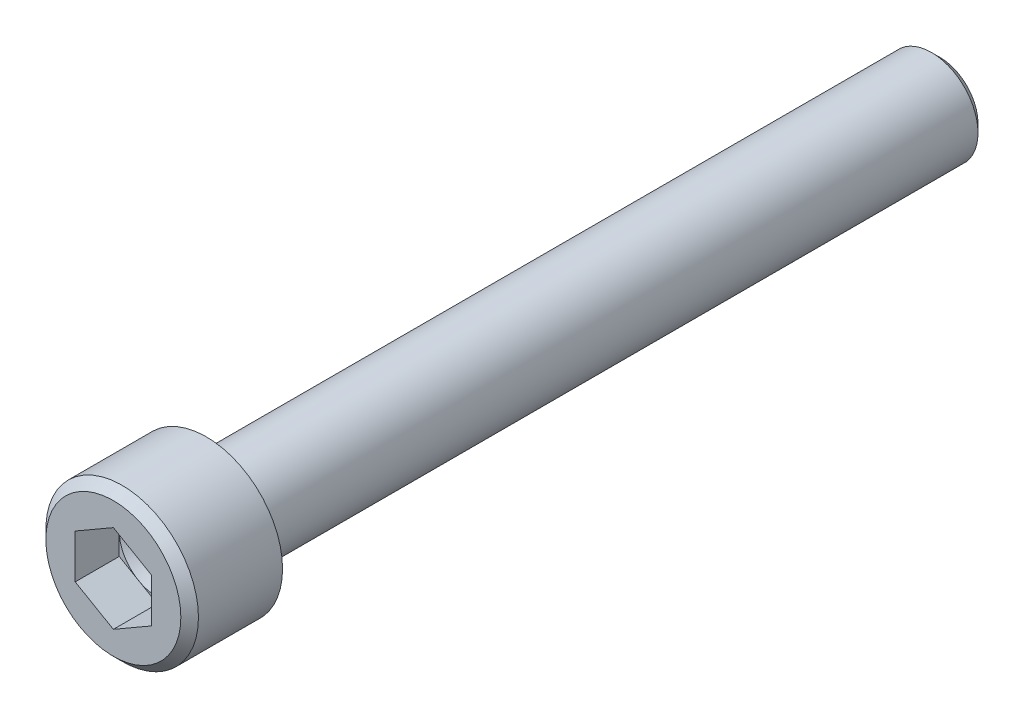
ISO-10303-21;
HEADER;
FILE_DESCRIPTION(('STEP AP214'),'2;1');
FILE_NAME('part.step','',(''),(''),'','','');
FILE_SCHEMA(('AUTOMOTIVE_DESIGN { 1 0 10303 214 1 1 1 1 }'));
ENDSEC;
DATA;
#1=APPLICATION_CONTEXT('core data for automotive mechanical design processes');
#2=APPLICATION_PROTOCOL_DEFINITION('international standard','automotive_design',2000,#1);
#3=PRODUCT_CONTEXT('',#1,'mechanical');
#4=PRODUCT('Part','Part','',(#3));
#5=PRODUCT_RELATED_PRODUCT_CATEGORY('part','',(#4));
#6=PRODUCT_DEFINITION_FORMATION('','',#4);
#7=PRODUCT_DEFINITION_CONTEXT('part definition',#1,'design');
#8=PRODUCT_DEFINITION('design','',#6,#7);
#9=PRODUCT_DEFINITION_SHAPE('','',#8);
#10=(LENGTH_UNIT() NAMED_UNIT(*) SI_UNIT(.MILLI.,.METRE.));
#11=(NAMED_UNIT(*) PLANE_ANGLE_UNIT() SI_UNIT($,.RADIAN.));
#12=(NAMED_UNIT(*) SI_UNIT($,.STERADIAN.) SOLID_ANGLE_UNIT());
#13=UNCERTAINTY_MEASURE_WITH_UNIT(LENGTH_MEASURE(1.E-05),#10,'distance_accuracy_value','');
#14=(GEOMETRIC_REPRESENTATION_CONTEXT(3) GLOBAL_UNCERTAINTY_ASSIGNED_CONTEXT((#13)) GLOBAL_UNIT_ASSIGNED_CONTEXT((#10,
#11,#12)) REPRESENTATION_CONTEXT('',''));
#15=CARTESIAN_POINT('',(0.,0.,0.));
#16=DIRECTION('',(0.,0.,1.));
#17=DIRECTION('',(1.,0.,0.));
#18=AXIS2_PLACEMENT_3D('',#15,#16,#17);
#19=CARTESIAN_POINT('',(0.,0.,2.54));
#20=DIRECTION('',(0.,0.,1.));
#21=DIRECTION('',(1.,0.,0.));
#22=AXIS2_PLACEMENT_3D('',#19,#20,#21);
#23=PLANE('',#22);
#24=DIRECTION('',(0.,1.,0.));
#25=VECTOR('',#24,1.);
#26=CARTESIAN_POINT('',(-1.9812,0.,2.54));
#27=LINE('',#26,#25);
#28=CARTESIAN_POINT('',(-1.9812,0.,2.54));
#29=VERTEX_POINT('',#28);
#30=CARTESIAN_POINT('',(-1.9812,1.14384635331848,2.54));
#31=VERTEX_POINT('',#30);
#32=EDGE_CURVE('E398',#29,#31,#27,.T.);
#33=ORIENTED_EDGE('',*,*,#32,.F.);
#34=CARTESIAN_POINT('',(0.,0.,2.54));
#35=DIRECTION('',(0.,0.,-1.));
#36=DIRECTION('',(-1.,0.,0.));
#37=AXIS2_PLACEMENT_3D('',#34,#35,#36);
#38=CIRCLE('',#37,1.9812);
#39=CARTESIAN_POINT('',(-0.9906,1.71576952997773,2.54));
#40=VERTEX_POINT('',#39);
#41=EDGE_CURVE('E33',#29,#40,#38,.T.);
#42=ORIENTED_EDGE('',*,*,#41,.T.);
#43=DIRECTION('',(0.866025403784439,0.5,0.));
#44=VECTOR('',#43,1.);
#45=CARTESIAN_POINT('',(0.163354175866616,2.38200528404682,2.54));
#46=LINE('',#45,#44);
#47=EDGE_CURVE('E393',#31,#40,#46,.T.);
#48=ORIENTED_EDGE('',*,*,#47,.F.);
#49=EDGE_LOOP('',(#33,#42,#48));
#50=FACE_BOUND('',#49,.T.);
#51=ADVANCED_FACE('F17',(#50),#23,.T.);
#52=CARTESIAN_POINT('',(0.,2.28769270663697,2.54));
#53=VERTEX_POINT('',#52);
#54=EDGE_CURVE('E390',#40,#53,#46,.T.);
#55=ORIENTED_EDGE('',*,*,#54,.F.);
#56=CARTESIAN_POINT('',(0.9906,1.71576952997773,2.54));
#57=VERTEX_POINT('',#56);
#58=EDGE_CURVE('E224',#40,#57,#38,.T.);
#59=ORIENTED_EDGE('',*,*,#58,.T.);
#60=DIRECTION('',(0.866025403784439,-0.5,0.));
#61=VECTOR('',#60,1.);
#62=CARTESIAN_POINT('',(-0.163354175866613,2.38200528404681,2.54));
#63=LINE('',#62,#61);
#64=EDGE_CURVE('E382',#53,#57,#63,.T.);
#65=ORIENTED_EDGE('',*,*,#64,.F.);
#66=EDGE_LOOP('',(#55,#59,#65));
#67=FACE_BOUND('',#66,.T.);
#68=ADVANCED_FACE('F105',(#67),#23,.T.);
#69=CARTESIAN_POINT('',(1.9812,1.14384635331849,2.54));
#70=VERTEX_POINT('',#69);
#71=EDGE_CURVE('E189',#57,#70,#63,.T.);
#72=ORIENTED_EDGE('',*,*,#71,.F.);
#73=CARTESIAN_POINT('',(1.9812,0.,2.54));
#74=VERTEX_POINT('',#73);
#75=EDGE_CURVE('E379',#57,#74,#38,.T.);
#76=ORIENTED_EDGE('',*,*,#75,.T.);
#77=DIRECTION('',(0.,-1.,0.));
#78=VECTOR('',#77,1.);
#79=CARTESIAN_POINT('',(1.9812,0.,2.54));
#80=LINE('',#79,#78);
#81=EDGE_CURVE('E160',#70,#74,#80,.T.);
#82=ORIENTED_EDGE('',*,*,#81,.F.);
#83=EDGE_LOOP('',(#72,#76,#82));
#84=FACE_BOUND('',#83,.T.);
#85=ADVANCED_FACE('F111',(#84),#23,.T.);
#86=CARTESIAN_POINT('',(1.9812,-1.14384635331849,2.54));
#87=VERTEX_POINT('',#86);
#88=EDGE_CURVE('E155',#74,#87,#80,.T.);
#89=ORIENTED_EDGE('',*,*,#88,.F.);
#90=CARTESIAN_POINT('',(0.9906,-1.71576952997773,2.54));
#91=VERTEX_POINT('',#90);
#92=EDGE_CURVE('E417',#74,#91,#38,.T.);
#93=ORIENTED_EDGE('',*,*,#92,.T.);
#94=DIRECTION('',(-0.866025403784438,-0.5,0.));
#95=VECTOR('',#94,1.);
#96=CARTESIAN_POINT('',(2.14455417586661,-1.04953377590865,2.54));
#97=LINE('',#96,#95);
#98=EDGE_CURVE('E148',#87,#91,#97,.T.);
#99=ORIENTED_EDGE('',*,*,#98,.F.);
#100=EDGE_LOOP('',(#89,#93,#99));
#101=FACE_BOUND('',#100,.T.);
#102=ADVANCED_FACE('F129',(#101),#23,.T.);
#103=CARTESIAN_POINT('',(0.,-2.28769270663697,2.54));
#104=VERTEX_POINT('',#103);
#105=EDGE_CURVE('E141',#91,#104,#97,.T.);
#106=ORIENTED_EDGE('',*,*,#105,.F.);
#107=CARTESIAN_POINT('',(-0.9906,-1.71576952997773,2.54));
#108=VERTEX_POINT('',#107);
#109=EDGE_CURVE('E143',#91,#108,#38,.T.);
#110=ORIENTED_EDGE('',*,*,#109,.T.);
#111=DIRECTION('',(-0.866025403784439,0.5,0.));
#112=VECTOR('',#111,1.);
#113=CARTESIAN_POINT('',(-2.14455417586661,-1.04953377590865,2.54));
#114=LINE('',#113,#112);
#115=EDGE_CURVE('E145',#104,#108,#114,.T.);
#116=ORIENTED_EDGE('',*,*,#115,.F.);
#117=EDGE_LOOP('',(#106,#110,#116));
#118=FACE_BOUND('',#117,.T.);
#119=ADVANCED_FACE('F119',(#118),#23,.T.);
#120=CARTESIAN_POINT('',(0.,0.,4.826));
#121=DIRECTION('',(0.,0.,1.));
#122=DIRECTION('',(1.,0.,0.));
#123=AXIS2_PLACEMENT_3D('',#120,#121,#122);
#124=PLANE('',#123);
#125=CARTESIAN_POINT('',(0.,0.,4.826));
#126=DIRECTION('',(0.,0.,1.));
#127=DIRECTION('',(1.,0.,0.));
#128=AXIS2_PLACEMENT_3D('',#125,#126,#127);
#129=CIRCLE('',#128,3.5052);
#130=CARTESIAN_POINT('',(3.5052,0.,4.826));
#131=VERTEX_POINT('',#130);
#132=EDGE_CURVE('E210',#131,#131,#129,.T.);
#133=ORIENTED_EDGE('',*,*,#132,.T.);
#134=EDGE_LOOP('',(#133));
#135=FACE_BOUND('',#134,.T.);
#136=DIRECTION('',(0.866025403784439,0.5,0.));
#137=VECTOR('',#136,1.);
#138=CARTESIAN_POINT('',(0.163354175866616,2.38200528404682,4.826));
#139=LINE('',#138,#137);
#140=CARTESIAN_POINT('',(-1.9812,1.14384635331848,4.826));
#141=VERTEX_POINT('',#140);
#142=CARTESIAN_POINT('',(0.,2.28769270663697,4.826));
#143=VERTEX_POINT('',#142);
#144=EDGE_CURVE('E171',#141,#143,#139,.T.);
#145=ORIENTED_EDGE('',*,*,#144,.T.);
#146=DIRECTION('',(0.866025403784439,-0.5,0.));
#147=VECTOR('',#146,1.);
#148=CARTESIAN_POINT('',(-0.163354175866613,2.38200528404681,4.826));
#149=LINE('',#148,#147);
#150=CARTESIAN_POINT('',(1.9812,1.14384635331849,4.826));
#151=VERTEX_POINT('',#150);
#152=EDGE_CURVE('E168',#143,#151,#149,.T.);
#153=ORIENTED_EDGE('',*,*,#152,.T.);
#154=DIRECTION('',(0.,-1.,0.));
#155=VECTOR('',#154,1.);
#156=CARTESIAN_POINT('',(1.9812,0.,4.826));
#157=LINE('',#156,#155);
#158=CARTESIAN_POINT('',(1.9812,-1.14384635331849,4.826));
#159=VERTEX_POINT('',#158);
#160=EDGE_CURVE('E185',#151,#159,#157,.T.);
#161=ORIENTED_EDGE('',*,*,#160,.T.);
#162=DIRECTION('',(-0.866025403784438,-0.5,0.));
#163=VECTOR('',#162,1.);
#164=CARTESIAN_POINT('',(2.14455417586661,-1.04953377590865,4.826));
#165=LINE('',#164,#163);
#166=CARTESIAN_POINT('',(0.,-2.28769270663697,4.826));
#167=VERTEX_POINT('',#166);
#168=EDGE_CURVE('E41',#159,#167,#165,.T.);
#169=ORIENTED_EDGE('',*,*,#168,.T.);
#170=DIRECTION('',(-0.866025403784439,0.5,0.));
#171=VECTOR('',#170,1.);
#172=CARTESIAN_POINT('',(-2.14455417586661,-1.04953377590865,4.826));
#173=LINE('',#172,#171);
#174=CARTESIAN_POINT('',(-1.9812,-1.14384635331849,4.826));
#175=VERTEX_POINT('',#174);
#176=EDGE_CURVE('E179',#167,#175,#173,.T.);
#177=ORIENTED_EDGE('',*,*,#176,.T.);
#178=DIRECTION('',(0.,1.,0.));
#179=VECTOR('',#178,1.);
#180=CARTESIAN_POINT('',(-1.9812,0.,4.826));
#181=LINE('',#180,#179);
#182=EDGE_CURVE('E175',#175,#141,#181,.T.);
#183=ORIENTED_EDGE('',*,*,#182,.T.);
#184=EDGE_LOOP('',(#145,#153,#161,#169,#177,#183));
#185=FACE_BOUND('',#184,.T.);
#186=ADVANCED_FACE('F128',(#135,#185),#124,.T.);
#187=CARTESIAN_POINT('',(0.,0.,4.826));
#188=DIRECTION('',(0.,0.,-1.));
#189=DIRECTION('',(-1.,0.,0.));
#190=AXIS2_PLACEMENT_3D('',#187,#188,#189);
#191=CYLINDRICAL_SURFACE('',#190,3.9624);
#192=CARTESIAN_POINT('',(0.,0.,4.3688));
#193=DIRECTION('',(0.,0.,1.));
#194=DIRECTION('',(1.,0.,0.));
#195=AXIS2_PLACEMENT_3D('',#192,#193,#194);
#196=CIRCLE('',#195,3.9624);
#197=CARTESIAN_POINT('',(3.9624,0.,4.3688));
#198=VERTEX_POINT('',#197);
#199=EDGE_CURVE('E214',#198,#198,#196,.F.);
#200=ORIENTED_EDGE('',*,*,#199,.T.);
#201=EDGE_LOOP('',(#200));
#202=FACE_BOUND('',#201,.T.);
#203=CARTESIAN_POINT('',(0.,0.,0.));
#204=DIRECTION('',(0.,0.,1.));
#205=DIRECTION('',(1.,0.,0.));
#206=AXIS2_PLACEMENT_3D('',#203,#204,#205);
#207=CIRCLE('',#206,3.9624);
#208=CARTESIAN_POINT('',(3.9624,0.,0.));
#209=VERTEX_POINT('',#208);
#210=EDGE_CURVE('E206',#209,#209,#207,.T.);
#211=ORIENTED_EDGE('',*,*,#210,.T.);
#212=EDGE_LOOP('',(#211));
#213=FACE_BOUND('',#212,.T.);
#214=ADVANCED_FACE('F134',(#202,#213),#191,.T.);
#215=CARTESIAN_POINT('',(0.,0.,0.));
#216=DIRECTION('',(0.,0.,1.));
#217=DIRECTION('',(1.,0.,0.));
#218=AXIS2_PLACEMENT_3D('',#215,#216,#217);
#219=PLANE('',#218);
#220=CARTESIAN_POINT('',(0.,0.,0.));
#221=DIRECTION('',(0.,0.,1.));
#222=DIRECTION('',(1.,0.,0.));
#223=AXIS2_PLACEMENT_3D('',#220,#221,#222);
#224=CIRCLE('',#223,2.5654);
#225=CARTESIAN_POINT('',(2.5654,0.,0.));
#226=VERTEX_POINT('',#225);
#227=EDGE_CURVE('E223',#226,#226,#224,.T.);
#228=ORIENTED_EDGE('',*,*,#227,.T.);
#229=EDGE_LOOP('',(#228));
#230=FACE_BOUND('',#229,.T.);
#231=ORIENTED_EDGE('',*,*,#210,.F.);
#232=EDGE_LOOP('',(#231));
#233=FACE_BOUND('',#232,.T.);
#234=ADVANCED_FACE('F323',(#230,#233),#219,.F.);
#235=CARTESIAN_POINT('',(0.,0.,4.826));
#236=DIRECTION('',(0.,0.,-1.));
#237=DIRECTION('',(-1.,0.,0.));
#238=AXIS2_PLACEMENT_3D('',#235,#236,#237);
#239=CONICAL_SURFACE('',#238,3.5052,0.785398163397449);
#240=ORIENTED_EDGE('',*,*,#199,.F.);
#241=EDGE_LOOP('',(#240));
#242=FACE_BOUND('',#241,.T.);
#243=ORIENTED_EDGE('',*,*,#132,.F.);
#244=EDGE_LOOP('',(#243));
#245=FACE_BOUND('',#244,.T.);
#246=ADVANCED_FACE('F314',(#242,#245),#239,.T.);
#247=CARTESIAN_POINT('',(-0.163354175866613,2.38200528404681,2.54));
#248=DIRECTION('',(-0.5,-0.866025403784439,0.));
#249=DIRECTION('',(0.866025403784439,-0.5,0.));
#250=AXIS2_PLACEMENT_3D('',#247,#248,#249);
#251=PLANE('',#250);
#252=ORIENTED_EDGE('',*,*,#152,.F.);
#253=DIRECTION('',(0.,0.,1.));
#254=VECTOR('',#253,1.);
#255=CARTESIAN_POINT('',(0.,2.28769270663697,2.54));
#256=LINE('',#255,#254);
#257=EDGE_CURVE('E203',#53,#143,#256,.T.);
#258=ORIENTED_EDGE('',*,*,#257,.F.);
#259=ORIENTED_EDGE('',*,*,#64,.T.);
#260=ORIENTED_EDGE('',*,*,#71,.T.);
#261=DIRECTION('',(0.,0.,1.));
#262=VECTOR('',#261,1.);
#263=CARTESIAN_POINT('',(1.9812,1.14384635331849,2.54));
#264=LINE('',#263,#262);
#265=EDGE_CURVE('E167',#70,#151,#264,.T.);
#266=ORIENTED_EDGE('',*,*,#265,.T.);
#267=EDGE_LOOP('',(#252,#258,#259,#260,#266));
#268=FACE_BOUND('',#267,.T.);
#269=ADVANCED_FACE('F305',(#268),#251,.T.);
#270=CARTESIAN_POINT('',(0.163354175866616,2.38200528404682,2.54));
#271=DIRECTION('',(0.5,-0.866025403784438,0.));
#272=DIRECTION('',(0.866025403784438,0.5,0.));
#273=AXIS2_PLACEMENT_3D('',#270,#271,#272);
#274=PLANE('',#273);
#275=ORIENTED_EDGE('',*,*,#144,.F.);
#276=DIRECTION('',(0.,0.,1.));
#277=VECTOR('',#276,1.);
#278=CARTESIAN_POINT('',(-1.9812,1.14384635331848,2.54));
#279=LINE('',#278,#277);
#280=EDGE_CURVE('E200',#31,#141,#279,.T.);
#281=ORIENTED_EDGE('',*,*,#280,.F.);
#282=ORIENTED_EDGE('',*,*,#47,.T.);
#283=ORIENTED_EDGE('',*,*,#54,.T.);
#284=ORIENTED_EDGE('',*,*,#257,.T.);
#285=EDGE_LOOP('',(#275,#281,#282,#283,#284));
#286=FACE_BOUND('',#285,.T.);
#287=ADVANCED_FACE('F296',(#286),#274,.T.);
#288=CARTESIAN_POINT('',(-1.9812,0.,2.54));
#289=DIRECTION('',(1.,0.,0.));
#290=DIRECTION('',(0.,1.,0.));
#291=AXIS2_PLACEMENT_3D('',#288,#289,#290);
#292=PLANE('',#291);
#293=ORIENTED_EDGE('',*,*,#182,.F.);
#294=DIRECTION('',(0.,0.,1.));
#295=VECTOR('',#294,1.);
#296=CARTESIAN_POINT('',(-1.9812,-1.14384635331849,2.54));
#297=LINE('',#296,#295);
#298=CARTESIAN_POINT('',(-1.9812,-1.14384635331849,2.54));
#299=VERTEX_POINT('',#298);
#300=EDGE_CURVE('E197',#299,#175,#297,.T.);
#301=ORIENTED_EDGE('',*,*,#300,.F.);
#302=EDGE_CURVE('E399',#299,#29,#27,.T.);
#303=ORIENTED_EDGE('',*,*,#302,.T.);
#304=ORIENTED_EDGE('',*,*,#32,.T.);
#305=ORIENTED_EDGE('',*,*,#280,.T.);
#306=EDGE_LOOP('',(#293,#301,#303,#304,#305));
#307=FACE_BOUND('',#306,.T.);
#308=ADVANCED_FACE('F287',(#307),#292,.T.);
#309=CARTESIAN_POINT('',(-2.14455417586661,-1.04953377590865,2.54));
#310=DIRECTION('',(0.5,0.866025403784439,0.));
#311=DIRECTION('',(-0.866025403784439,0.5,0.));
#312=AXIS2_PLACEMENT_3D('',#309,#310,#311);
#313=PLANE('',#312);
#314=ORIENTED_EDGE('',*,*,#176,.F.);
#315=DIRECTION('',(0.,0.,1.));
#316=VECTOR('',#315,1.);
#317=CARTESIAN_POINT('',(0.,-2.28769270663697,2.54));
#318=LINE('',#317,#316);
#319=EDGE_CURVE('E194',#104,#167,#318,.T.);
#320=ORIENTED_EDGE('',*,*,#319,.F.);
#321=ORIENTED_EDGE('',*,*,#115,.T.);
#322=EDGE_CURVE('E402',#108,#299,#114,.T.);
#323=ORIENTED_EDGE('',*,*,#322,.T.);
#324=ORIENTED_EDGE('',*,*,#300,.T.);
#325=EDGE_LOOP('',(#314,#320,#321,#323,#324));
#326=FACE_BOUND('',#325,.T.);
#327=ADVANCED_FACE('F279',(#326),#313,.T.);
#328=CARTESIAN_POINT('',(2.14455417586661,-1.04953377590865,2.54));
#329=DIRECTION('',(-0.5,0.866025403784438,0.));
#330=DIRECTION('',(-0.866025403784438,-0.5,0.));
#331=AXIS2_PLACEMENT_3D('',#328,#329,#330);
#332=PLANE('',#331);
#333=ORIENTED_EDGE('',*,*,#168,.F.);
#334=DIRECTION('',(0.,0.,1.));
#335=VECTOR('',#334,1.);
#336=CARTESIAN_POINT('',(1.9812,-1.14384635331849,2.54));
#337=LINE('',#336,#335);
#338=EDGE_CURVE('E151',#87,#159,#337,.T.);
#339=ORIENTED_EDGE('',*,*,#338,.F.);
#340=ORIENTED_EDGE('',*,*,#98,.T.);
#341=ORIENTED_EDGE('',*,*,#105,.T.);
#342=ORIENTED_EDGE('',*,*,#319,.T.);
#343=EDGE_LOOP('',(#333,#339,#340,#341,#342));
#344=FACE_BOUND('',#343,.T.);
#345=ADVANCED_FACE('F124',(#344),#332,.T.);
#346=CARTESIAN_POINT('',(1.9812,0.,2.54));
#347=DIRECTION('',(-1.,0.,0.));
#348=DIRECTION('',(0.,-1.,0.));
#349=AXIS2_PLACEMENT_3D('',#346,#347,#348);
#350=PLANE('',#349);
#351=ORIENTED_EDGE('',*,*,#160,.F.);
#352=ORIENTED_EDGE('',*,*,#265,.F.);
#353=ORIENTED_EDGE('',*,*,#81,.T.);
#354=ORIENTED_EDGE('',*,*,#88,.T.);
#355=ORIENTED_EDGE('',*,*,#338,.T.);
#356=EDGE_LOOP('',(#351,#352,#353,#354,#355));
#357=FACE_BOUND('',#356,.T.);
#358=ADVANCED_FACE('F117',(#357),#350,.T.);
#359=ORIENTED_EDGE('',*,*,#322,.F.);
#360=EDGE_CURVE('E218',#108,#29,#38,.T.);
#361=ORIENTED_EDGE('',*,*,#360,.T.);
#362=ORIENTED_EDGE('',*,*,#302,.F.);
#363=EDGE_LOOP('',(#359,#361,#362));
#364=FACE_BOUND('',#363,.T.);
#365=ADVANCED_FACE('F108',(#364),#23,.T.);
#366=CARTESIAN_POINT('',(0.,0.,-38.1));
#367=DIRECTION('',(0.,0.,1.));
#368=DIRECTION('',(1.,0.,0.));
#369=AXIS2_PLACEMENT_3D('',#366,#367,#368);
#370=CYLINDRICAL_SURFACE('',#369,2.413);
#371=CARTESIAN_POINT('',(0.,0.,-37.67105761938));
#372=DIRECTION('',(0.,0.,-1.));
#373=DIRECTION('',(-1.,0.,0.));
#374=AXIS2_PLACEMENT_3D('',#371,#372,#373);
#375=CIRCLE('',#374,2.413);
#376=CARTESIAN_POINT('',(-2.413,0.,-37.67105761938));
#377=VERTEX_POINT('',#376);
#378=EDGE_CURVE('E11',#377,#377,#375,.F.);
#379=ORIENTED_EDGE('',*,*,#378,.T.);
#380=EDGE_LOOP('',(#379));
#381=FACE_BOUND('',#380,.T.);
#382=CARTESIAN_POINT('',(0.,0.,-0.152399999999997));
#383=DIRECTION('',(0.,0.,1.));
#384=DIRECTION('',(1.,0.,0.));
#385=AXIS2_PLACEMENT_3D('',#382,#383,#384);
#386=CIRCLE('',#385,2.413);
#387=CARTESIAN_POINT('',(2.413,0.,-0.152399999999997));
#388=VERTEX_POINT('',#387);
#389=EDGE_CURVE('E219',#388,#388,#386,.F.);
#390=ORIENTED_EDGE('',*,*,#389,.T.);
#391=EDGE_LOOP('',(#390));
#392=FACE_BOUND('',#391,.T.);
#393=ADVANCED_FACE('F101',(#381,#392),#370,.T.);
#394=CARTESIAN_POINT('',(0.,0.,-38.1));
#395=DIRECTION('',(0.,0.,-1.));
#396=DIRECTION('',(1.,0.,0.));
#397=AXIS2_PLACEMENT_3D('',#394,#395,#396);
#398=PLANE('',#397);
#399=CARTESIAN_POINT('',(0.,0.,-38.1));
#400=DIRECTION('',(0.,0.,-1.));
#401=DIRECTION('',(-1.,0.,0.));
#402=AXIS2_PLACEMENT_3D('',#399,#400,#401);
#403=CIRCLE('',#402,1.98405761938);
#404=CARTESIAN_POINT('',(-1.98405761938,0.,-38.1));
#405=VERTEX_POINT('',#404);
#406=EDGE_CURVE('E26',#405,#405,#403,.T.);
#407=ORIENTED_EDGE('',*,*,#406,.T.);
#408=EDGE_LOOP('',(#407));
#409=FACE_BOUND('',#408,.T.);
#410=ADVANCED_FACE('F94',(#409),#398,.T.);
#411=CARTESIAN_POINT('',(0.,0.,1.39615364668151));
#412=DIRECTION('',(0.,0.,1.));
#413=DIRECTION('',(1.,0.,0.));
#414=AXIS2_PLACEMENT_3D('',#411,#412,#413);
#415=CONICAL_SURFACE('',#414,0.,1.0471975511966);
#416=ORIENTED_EDGE('',*,*,#41,.F.);
#417=ORIENTED_EDGE('',*,*,#360,.F.);
#418=ORIENTED_EDGE('',*,*,#109,.F.);
#419=ORIENTED_EDGE('',*,*,#92,.F.);
#420=ORIENTED_EDGE('',*,*,#75,.F.);
#421=ORIENTED_EDGE('',*,*,#58,.F.);
#422=EDGE_LOOP('',(#416,#417,#418,#419,#420,#421));
#423=FACE_BOUND('',#422,.T.);
#424=CARTESIAN_POINT('',(0.,0.,1.39615364668151));
#425=VERTEX_POINT('',#424);
#426=VERTEX_LOOP('',#425);
#427=FACE_BOUND('',#426,.T.);
#428=ADVANCED_FACE('F91',(#423,#427),#415,.F.);
#429=CARTESIAN_POINT('',(0.,0.,-0.152399999999997));
#430=DIRECTION('',(0.,0.,1.));
#431=DIRECTION('',(1.,0.,0.));
#432=AXIS2_PLACEMENT_3D('',#429,#430,#431);
#433=TOROIDAL_SURFACE('',#432,2.5654,0.1524);
#434=ORIENTED_EDGE('',*,*,#227,.F.);
#435=EDGE_LOOP('',(#434));
#436=FACE_BOUND('',#435,.T.);
#437=ORIENTED_EDGE('',*,*,#389,.F.);
#438=EDGE_LOOP('',(#437));
#439=FACE_BOUND('',#438,.T.);
#440=ADVANCED_FACE('F93',(#436,#439),#433,.F.);
#441=CARTESIAN_POINT('',(0.,0.,-38.1));
#442=DIRECTION('',(0.,0.,1.));
#443=DIRECTION('',(1.,0.,0.));
#444=AXIS2_PLACEMENT_3D('',#441,#442,#443);
#445=CONICAL_SURFACE('',#444,1.98405761938,0.785398163397445);
#446=ORIENTED_EDGE('',*,*,#378,.F.);
#447=EDGE_LOOP('',(#446));
#448=FACE_BOUND('',#447,.T.);
#449=ORIENTED_EDGE('',*,*,#406,.F.);
#450=EDGE_LOOP('',(#449));
#451=FACE_BOUND('',#450,.T.);
#452=ADVANCED_FACE('F19',(#448,#451),#445,.T.);
#453=CLOSED_SHELL('',(#51,#68,#85,#102,#119,#186,#214,#234,#246,#269,#287,#308,#327,#345,#358,
#365,#393,#410,#428,#440,#452));
#454=MANIFOLD_SOLID_BREP('B1',#453);
#455=ADVANCED_BREP_SHAPE_REPRESENTATION('',(#18,#454),#14);
#456=SHAPE_DEFINITION_REPRESENTATION(#9,#455);
ENDSEC;
END-ISO-10303-21;
